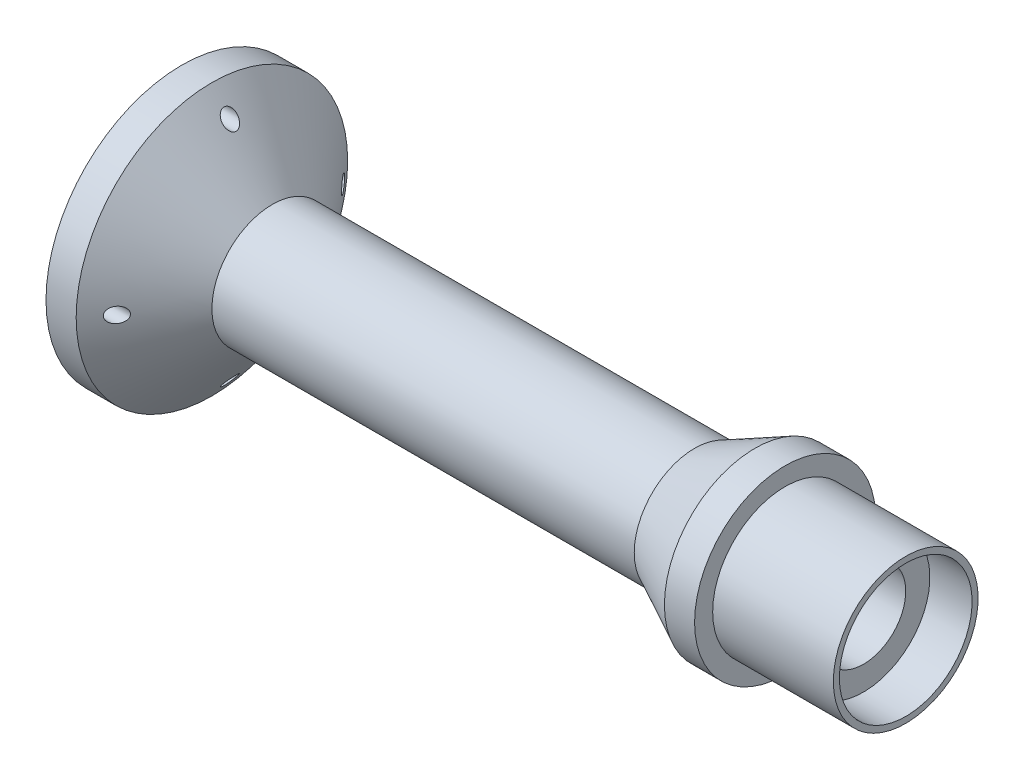
ISO-10303-21;
HEADER;
FILE_DESCRIPTION(('STEP AP214'),'2;1');
FILE_NAME('part.step','',(''),(''),'','','');
FILE_SCHEMA(('AUTOMOTIVE_DESIGN { 1 0 10303 214 1 1 1 1 }'));
ENDSEC;
DATA;
#1=APPLICATION_CONTEXT('core data for automotive mechanical design processes');
#2=APPLICATION_PROTOCOL_DEFINITION('international standard','automotive_design',2000,#1);
#3=PRODUCT_CONTEXT('',#1,'mechanical');
#4=PRODUCT('Part','Part','',(#3));
#5=PRODUCT_RELATED_PRODUCT_CATEGORY('part','',(#4));
#6=PRODUCT_DEFINITION_FORMATION('','',#4);
#7=PRODUCT_DEFINITION_CONTEXT('part definition',#1,'design');
#8=PRODUCT_DEFINITION('design','',#6,#7);
#9=PRODUCT_DEFINITION_SHAPE('','',#8);
#10=(LENGTH_UNIT() NAMED_UNIT(*) SI_UNIT(.MILLI.,.METRE.));
#11=(NAMED_UNIT(*) PLANE_ANGLE_UNIT() SI_UNIT($,.RADIAN.));
#12=(NAMED_UNIT(*) SI_UNIT($,.STERADIAN.) SOLID_ANGLE_UNIT());
#13=UNCERTAINTY_MEASURE_WITH_UNIT(LENGTH_MEASURE(1.E-05),#10,'distance_accuracy_value','');
#14=(GEOMETRIC_REPRESENTATION_CONTEXT(3) GLOBAL_UNCERTAINTY_ASSIGNED_CONTEXT((#13)) GLOBAL_UNIT_ASSIGNED_CONTEXT((#10,
#11,#12)) REPRESENTATION_CONTEXT('',''));
#15=CARTESIAN_POINT('',(0.,0.,0.));
#16=DIRECTION('',(0.,0.,1.));
#17=DIRECTION('',(1.,0.,0.));
#18=AXIS2_PLACEMENT_3D('',#15,#16,#17);
#19=CARTESIAN_POINT('',(-14.2227480967605,6.99999999999999,0.));
#20=DIRECTION('',(1.,0.,0.));
#21=DIRECTION('',(0.,0.,-1.));
#22=AXIS2_PLACEMENT_3D('',#19,#20,#21);
#23=PLANE('',#22);
#24=CARTESIAN_POINT('',(-14.2227480967605,0.,18.75));
#25=DIRECTION('',(-1.,0.,0.));
#26=DIRECTION('',(0.,-1.,0.));
#27=AXIS2_PLACEMENT_3D('',#24,#25,#26);
#28=CIRCLE('',#27,1.25);
#29=CARTESIAN_POINT('',(-14.2227480967605,-1.25000000000007,18.75));
#30=VERTEX_POINT('',#29);
#31=EDGE_CURVE('E129',#30,#30,#28,.T.);
#32=ORIENTED_EDGE('',*,*,#31,.F.);
#33=EDGE_LOOP('',(#32));
#34=FACE_BOUND('',#33,.T.);
#35=CARTESIAN_POINT('',(-14.2227480967605,-18.75,0.));
#36=DIRECTION('',(-1.,0.,0.));
#37=DIRECTION('',(0.,0.,-1.));
#38=AXIS2_PLACEMENT_3D('',#35,#36,#37);
#39=CIRCLE('',#38,1.25);
#40=CARTESIAN_POINT('',(-14.2227480967605,-18.75,-1.25));
#41=VERTEX_POINT('',#40);
#42=EDGE_CURVE('E133',#41,#41,#39,.T.);
#43=ORIENTED_EDGE('',*,*,#42,.F.);
#44=EDGE_LOOP('',(#43));
#45=FACE_BOUND('',#44,.T.);
#46=CARTESIAN_POINT('',(-14.2227480967605,1.96395825309926E-13,-18.75));
#47=DIRECTION('',(-1.,0.,0.));
#48=DIRECTION('',(0.,1.,0.));
#49=AXIS2_PLACEMENT_3D('',#46,#47,#48);
#50=CIRCLE('',#49,1.25);
#51=CARTESIAN_POINT('',(-14.2227480967605,1.2500000000002,-18.75));
#52=VERTEX_POINT('',#51);
#53=EDGE_CURVE('E137',#52,#52,#50,.T.);
#54=ORIENTED_EDGE('',*,*,#53,.F.);
#55=EDGE_LOOP('',(#54));
#56=FACE_BOUND('',#55,.T.);
#57=CARTESIAN_POINT('',(-14.2227480967605,18.75,0.));
#58=DIRECTION('',(-1.,0.,0.));
#59=DIRECTION('',(0.,0.,1.));
#60=AXIS2_PLACEMENT_3D('',#57,#58,#59);
#61=CIRCLE('',#60,1.25);
#62=CARTESIAN_POINT('',(-14.2227480967605,18.75,1.25));
#63=VERTEX_POINT('',#62);
#64=EDGE_CURVE('E60',#63,#63,#61,.T.);
#65=ORIENTED_EDGE('',*,*,#64,.F.);
#66=EDGE_LOOP('',(#65));
#67=FACE_BOUND('',#66,.T.);
#68=CARTESIAN_POINT('',(-14.2227480967606,0.,0.));
#69=DIRECTION('',(-1.,0.,0.));
#70=DIRECTION('',(0.,0.,1.));
#71=AXIS2_PLACEMENT_3D('',#68,#69,#70);
#72=CIRCLE('',#71,6.99999999999999);
#73=CARTESIAN_POINT('',(-14.2227480967606,0.,6.99999999999999));
#74=VERTEX_POINT('',#73);
#75=EDGE_CURVE('E59',#74,#74,#72,.T.);
#76=ORIENTED_EDGE('',*,*,#75,.F.);
#77=EDGE_LOOP('',(#76));
#78=FACE_BOUND('',#77,.T.);
#79=CARTESIAN_POINT('',(-14.2227480967605,0.,0.));
#80=DIRECTION('',(-1.,0.,0.));
#81=DIRECTION('',(0.,0.,1.));
#82=AXIS2_PLACEMENT_3D('',#79,#80,#81);
#83=CIRCLE('',#82,22.5);
#84=CARTESIAN_POINT('',(-14.2227480967605,0.,22.5));
#85=VERTEX_POINT('',#84);
#86=EDGE_CURVE('E10',#85,#85,#83,.T.);
#87=ORIENTED_EDGE('',*,*,#86,.T.);
#88=EDGE_LOOP('',(#87));
#89=FACE_BOUND('',#88,.T.);
#90=ADVANCED_FACE('F31',(#34,#45,#56,#67,#78,#89),#23,.F.);
#91=CARTESIAN_POINT('',(0.,0.,0.));
#92=DIRECTION('',(-1.,0.,0.));
#93=DIRECTION('',(0.,0.,1.));
#94=AXIS2_PLACEMENT_3D('',#91,#92,#93);
#95=CYLINDRICAL_SURFACE('',#94,22.5);
#96=ORIENTED_EDGE('',*,*,#86,.F.);
#97=EDGE_LOOP('',(#96));
#98=FACE_BOUND('',#97,.T.);
#99=CARTESIAN_POINT('',(-9.22274809676054,0.,0.));
#100=DIRECTION('',(-1.,0.,0.));
#101=DIRECTION('',(0.,0.,1.));
#102=AXIS2_PLACEMENT_3D('',#99,#100,#101);
#103=CIRCLE('',#102,22.5);
#104=CARTESIAN_POINT('',(-9.22274809676054,0.,22.5));
#105=VERTEX_POINT('',#104);
#106=EDGE_CURVE('E43',#105,#105,#103,.T.);
#107=ORIENTED_EDGE('',*,*,#106,.T.);
#108=EDGE_LOOP('',(#107));
#109=FACE_BOUND('',#108,.T.);
#110=ADVANCED_FACE('F115',(#98,#109),#95,.T.);
#111=CARTESIAN_POINT('',(0.777251903239451,0.,0.));
#112=DIRECTION('',(-1.,0.,0.));
#113=DIRECTION('',(0.,0.,1.));
#114=AXIS2_PLACEMENT_3D('',#111,#112,#113);
#115=CONICAL_SURFACE('',#114,9.99999999999999,0.896055384571344);
#116=CARTESIAN_POINT('',(-6.87670378722897,-0.965765888497973,19.5435970316312));
#117=CARTESIAN_POINT('',(-6.91438438359733,-0.925371062022248,19.5927517523525));
#118=CARTESIAN_POINT('',(-6.95025639504498,-0.880481631938702,19.6397252175365));
#119=CARTESIAN_POINT('',(-7.01716249747079,-0.781774825555448,19.7276000037425));
#120=CARTESIAN_POINT('',(-7.04818845675402,-0.727942749200885,19.7684911131804));
#121=CARTESIAN_POINT('',(-7.10416139474303,-0.611453025938683,19.8424374038877));
#122=CARTESIAN_POINT('',(-7.12905412500325,-0.548723849578808,19.8754225921607));
#123=CARTESIAN_POINT('',(-7.17078305701836,-0.416316704997197,19.930807404557));
#124=CARTESIAN_POINT('',(-7.18763314383691,-0.346650965501321,19.9532252715871));
#125=CARTESIAN_POINT('',(-7.21019210371205,-0.213392326131725,19.9832607455488));
#126=CARTESIAN_POINT('',(-7.21716525253353,-0.150390554747603,19.992557131752));
#127=CARTESIAN_POINT('',(-7.22379820012534,-0.0233322763961994,20.0013996418606));
#128=CARTESIAN_POINT('',(-7.22346239040761,0.0407235741187451,20.0009516205923));
#129=CARTESIAN_POINT('',(-7.21595157436366,0.160584986814371,19.9909394931205));
#130=CARTESIAN_POINT('',(-7.20952840373848,0.216526813363729,19.9823775268471));
#131=CARTESIAN_POINT('',(-7.19127175817364,0.325892651835949,19.9580693838317));
#132=CARTESIAN_POINT('',(-7.17943827273827,0.379316658874151,19.9423231931527));
#133=CARTESIAN_POINT('',(-7.15052894114499,0.48391165180784,19.9039162271677));
#134=CARTESIAN_POINT('',(-7.13331445213224,0.534976365655285,19.8810726944295));
#135=CARTESIAN_POINT('',(-7.09450348825448,0.632322518951626,19.8296767976997));
#136=CARTESIAN_POINT('',(-7.07290532914588,0.678602109568131,19.801122239545));
#137=CARTESIAN_POINT('',(-7.02291341430539,0.771739478498307,19.7351883464936));
#138=CARTESIAN_POINT('',(-6.99399650306693,0.817839447481196,19.6971387962385));
#139=CARTESIAN_POINT('',(-6.93244976711782,0.902930780359497,19.6164074064193));
#140=CARTESIAN_POINT('',(-6.8998177606586,0.941917931802534,19.5737228455587));
#141=CARTESIAN_POINT('',(-6.8250178932535,1.01966662936835,19.4762153702602));
#142=CARTESIAN_POINT('',(-6.78223181761343,1.05689954675944,19.420649185895));
#143=CARTESIAN_POINT('',(-6.69370922727141,1.12136903820618,19.3061947238403));
#144=CARTESIAN_POINT('',(-6.64797089448878,1.14859938200035,19.2473044019117));
#145=CARTESIAN_POINT('',(-6.54477632598425,1.19799551089414,19.1150571542002));
#146=CARTESIAN_POINT('',(-6.48685583980991,1.21794271647149,19.0412311117094));
#147=CARTESIAN_POINT('',(-6.36940702958332,1.24416129927918,18.8924090925181));
#148=CARTESIAN_POINT('',(-6.30987734035667,1.25042067066193,18.8174121468096));
#149=CARTESIAN_POINT('',(-6.18107626175588,1.24946648175131,18.6561175747977));
#150=CARTESIAN_POINT('',(-6.11173415853516,1.23999833256753,18.5698825472559));
#151=CARTESIAN_POINT('',(-5.97433272494049,1.20319133669582,18.4001889285737));
#152=CARTESIAN_POINT('',(-5.90627340524672,1.1758523412865,18.3167303605453));
#153=CARTESIAN_POINT('',(-5.78399931516152,1.10865780806864,18.167787353033));
#154=CARTESIAN_POINT('',(-5.7292826795341,1.07142470133918,18.1015317359721));
#155=CARTESIAN_POINT('',(-5.62404500219,0.983592915924127,17.974774958335));
#156=CARTESIAN_POINT('',(-5.57351831904188,0.93301260519025,17.9142660437908));
#157=CARTESIAN_POINT('',(-5.48986200306515,0.831427368285954,17.814550201221));
#158=CARTESIAN_POINT('',(-5.45540240043487,0.783189672461332,17.7736430509625));
#159=CARTESIAN_POINT('',(-5.39179029870844,0.678742891753287,17.6983645404968));
#160=CARTESIAN_POINT('',(-5.36263109565057,0.622544038607519,17.6639849217614));
#161=CARTESIAN_POINT('',(-5.31585059468833,0.51340199479956,17.6089619810765));
#162=CARTESIAN_POINT('',(-5.29710172302202,0.461628417736807,17.5869658369315));
#163=CARTESIAN_POINT('',(-5.26539673220317,0.353986860268963,17.5498220002909));
#164=CARTESIAN_POINT('',(-5.25243719016564,0.298121322000789,17.5346702610478));
#165=CARTESIAN_POINT('',(-5.23314940958656,0.183373669540542,17.5121353630539));
#166=CARTESIAN_POINT('',(-5.22685828783104,0.124476564627158,17.5047956857337));
#167=CARTESIAN_POINT('',(-5.22155429885013,0.00591363480842162,17.498606950173));
#168=CARTESIAN_POINT('',(-5.22253915528182,-0.0537519438431116,17.4997552364112));
#169=CARTESIAN_POINT('',(-5.23126389457711,-0.16624545079928,17.5099375178887));
#170=CARTESIAN_POINT('',(-5.23836808621042,-0.219193872841721,17.5182294296655));
#171=CARTESIAN_POINT('',(-5.25801253144165,-0.32262241416195,17.5411896740102));
#172=CARTESIAN_POINT('',(-5.2705533525931,-0.373102275123429,17.5558586723106));
#173=CARTESIAN_POINT('',(-5.30101229547472,-0.472672796439294,17.5915534679253));
#174=CARTESIAN_POINT('',(-5.3191386852663,-0.521610074289808,17.6128257597406));
#175=CARTESIAN_POINT('',(-5.35965639132989,-0.614998111505125,17.660490194846));
#176=CARTESIAN_POINT('',(-5.38205020167623,-0.659446223838874,17.6868853323271));
#177=CARTESIAN_POINT('',(-5.44125760429919,-0.762656001992348,17.756866280301));
#178=CARTESIAN_POINT('',(-5.47999548720466,-0.818725694776381,17.8028086698598));
#179=CARTESIAN_POINT('',(-5.56260226733139,-0.920397655867401,17.9012375312287));
#180=CARTESIAN_POINT('',(-5.60648200281037,-0.965977190997547,17.9537378420926));
#181=CARTESIAN_POINT('',(-5.7098671054036,-1.05755735418722,18.0780539649628));
#182=CARTESIAN_POINT('',(-5.77042291508978,-1.10044120067992,18.1512916255385));
#183=CARTESIAN_POINT('',(-5.89462846215224,-1.17012388073995,18.3025084814554));
#184=CARTESIAN_POINT('',(-5.95827903172755,-1.1969183616339,18.3804889535966));
#185=CARTESIAN_POINT('',(-6.08759505935107,-1.23498236384621,18.5399771135167));
#186=CARTESIAN_POINT('',(-6.15327489810404,-1.24607997257237,18.6215139270986));
#187=CARTESIAN_POINT('',(-6.28448189862038,-1.25218939408474,18.7854797427909));
#188=CARTESIAN_POINT('',(-6.3500087601464,-1.24718073971286,18.8679097473328));
#189=CARTESIAN_POINT('',(-6.48534946191309,-1.21945319998994,19.0392502094973));
#190=CARTESIAN_POINT('',(-6.55498892743953,-1.19511724887691,19.1280433239983));
#191=CARTESIAN_POINT('',(-6.68957930291789,-1.12594156939992,19.3007658028269));
#192=CARTESIAN_POINT('',(-6.75454973147697,-1.08119373574188,19.3847150861251));
#193=CARTESIAN_POINT('',(-6.83646220905368,-1.00711730998758,19.4911509952201));
#194=CARTESIAN_POINT('',(-6.85683444169113,-0.987066474012631,19.5176772685446));
#195=CARTESIAN_POINT('',(-6.87670378722897,-0.965765888497973,19.5435970316312));
#196=B_SPLINE_CURVE_WITH_KNOTS('',3,(#116,#117,#118,#119,#120,#121,#122,#123,#124,#125,#126,
#127,#128,#129,#130,#131,#132,#133,#134,#135,#136,#137,#138,#139,#140,#141,#142,#143,#144,#145,
#146,#147,#148,#149,#150,#151,#152,#153,#154,#155,#156,#157,#158,#159,#160,#161,#162,#163,#164,
#165,#166,#167,#168,#169,#170,#171,#172,#173,#174,#175,#176,#177,#178,#179,#180,#181,#182,#183,
#184,#185,#186,#187,#188,#189,#190,#191,#192,#193,#194,#195),.UNSPECIFIED.,.T.,.F.,(4,2,2,2,2,2,
2,2,2,2,2,2,2,2,2,2,2,2,2,2,2,2,2,2,2,2,2,2,2,2,2,2,2,2,2,2,2,2,2,4),(0.,0.221740182377141,
0.443848538361616,0.667856091715364,0.891475500130169,1.08256008731353,1.27352986647541,
1.44361836741022,1.61370719830919,1.788600667749,1.96356146039212,2.16203038716296,
2.3606164751028,2.59795450065903,2.83544010629957,3.12213496929721,3.40908119686408,
3.7408000294681,4.07252162267552,4.35242328856895,4.63194175447357,4.84724333214516,
5.06227067161015,5.2394298590767,5.41648416381257,5.59451886893816,5.77249787696541,
5.933951624957,6.09542223187148,6.26384479492505,6.43236609534984,6.67758244227029,
6.92332529518567,7.23447458320957,7.54570800890564,7.86032435506921,8.17534066029726,
8.51990388783412,8.86293096570011,8.97985672399241),.UNSPECIFIED.);
#197=CARTESIAN_POINT('',(-6.87670378722897,-0.965765888497973,19.5435970316312));
#198=VERTEX_POINT('',#197);
#199=EDGE_CURVE('E34',#198,#198,#196,.T.);
#200=ORIENTED_EDGE('',*,*,#199,.T.);
#201=EDGE_LOOP('',(#200));
#202=FACE_BOUND('',#201,.T.);
#203=CARTESIAN_POINT('',(-7.10466391561831,-19.8431354198869,-0.606263106075891));
#204=CARTESIAN_POINT('',(-7.12524215492308,-19.8703705516847,-0.557152061023519));
#205=CARTESIAN_POINT('',(-7.14359337620249,-19.8947112379774,-0.505441470730656));
#206=CARTESIAN_POINT('',(-7.17501703582346,-19.9364431367164,-0.397730319003898));
#207=CARTESIAN_POINT('',(-7.18808686252739,-19.9538309109191,-0.341727651391252));
#208=CARTESIAN_POINT('',(-7.20828710079906,-19.9807230525613,-0.226556630713434));
#209=CARTESIAN_POINT('',(-7.2153938116383,-19.9901959613114,-0.167376630697725));
#210=CARTESIAN_POINT('',(-7.22313950260351,-20.0005212097117,-0.0478627158375789));
#211=CARTESIAN_POINT('',(-7.22378121925231,-20.0013771967593,0.0124706999495841));
#212=CARTESIAN_POINT('',(-7.21870726931353,-19.9946127147333,0.129107660411904));
#213=CARTESIAN_POINT('',(-7.21333154523356,-19.9874454983325,0.185453469614146));
#214=CARTESIAN_POINT('',(-7.19706469098579,-19.9657802254267,0.295881703378825));
#215=CARTESIAN_POINT('',(-7.1861728581561,-19.9512812349741,0.349963838635834));
#216=CARTESIAN_POINT('',(-7.1591639672876,-19.9153819386682,0.455583541155038));
#217=CARTESIAN_POINT('',(-7.14295215271335,-19.8938565217301,0.507053801806073));
#218=CARTESIAN_POINT('',(-7.10607420051279,-19.8449878661884,0.605410044469264));
#219=CARTESIAN_POINT('',(-7.08540655431303,-19.8176426572671,0.652294466058288));
#220=CARTESIAN_POINT('',(-7.03749114722785,-19.7543939811494,0.746529909730399));
#221=CARTESIAN_POINT('',(-7.00974183636218,-19.7178456074332,0.793190590479528));
#222=CARTESIAN_POINT('',(-6.95047070966133,-19.6400157837598,0.879636674101394));
#223=CARTESIAN_POINT('',(-6.91894672317731,-19.5987316110329,0.919418088565018));
#224=CARTESIAN_POINT('',(-6.84662870169594,-19.5043376502165,0.998988749967489));
#225=CARTESIAN_POINT('',(-6.80521522645016,-19.4504768400556,1.03732215303783));
#226=CARTESIAN_POINT('',(-6.71935165459838,-19.3392863848301,1.10429191837341));
#227=CARTESIAN_POINT('',(-6.67489967274627,-19.2819545887547,1.13292219347318));
#228=CARTESIAN_POINT('',(-6.57437861175687,-19.1528975731836,1.18574642201646));
#229=CARTESIAN_POINT('',(-6.51781975130242,-19.0806636063012,1.20777088452617));
#230=CARTESIAN_POINT('',(-6.4029266291989,-18.9347712676133,1.23851750835295));
#231=CARTESIAN_POINT('',(-6.3445909302942,-18.8611117612687,1.24722859267553));
#232=CARTESIAN_POINT('',(-6.21767515661395,-18.7017994713089,1.25200888745258));
#233=CARTESIAN_POINT('',(-6.14898315385578,-18.6161597765837,1.24577201536447));
#234=CARTESIAN_POINT('',(-6.0125109391328,-18.4471846228775,1.21579900481378));
#235=CARTESIAN_POINT('',(-5.94473090082374,-18.3638495996493,1.19205958023227));
#236=CARTESIAN_POINT('',(-5.82042734148076,-18.2120361488024,1.13089791435167));
#237=CARTESIAN_POINT('',(-5.76355654044277,-18.1430035148375,1.09555943868603));
#238=CARTESIAN_POINT('',(-5.65382745564907,-18.0105440439987,1.01087495542869));
#239=CARTESIAN_POINT('',(-5.60096405112315,-17.947110035398,0.961547219573775));
#240=CARTESIAN_POINT('',(-5.51316722853762,-17.842275608832,0.861680391921483));
#241=CARTESIAN_POINT('',(-5.47692004592415,-17.7991784240227,0.814079805073192));
#242=CARTESIAN_POINT('',(-5.40965658196996,-17.7194685814832,0.710466141713361));
#243=CARTESIAN_POINT('',(-5.37863349330303,-17.6828474818302,0.654464195592078));
#244=CARTESIAN_POINT('',(-5.32863038689386,-17.6239752147391,0.545589072584731));
#245=CARTESIAN_POINT('',(-5.30848560424449,-17.6003210127047,0.494014176791489));
#246=CARTESIAN_POINT('',(-5.27395747774196,-17.559841074919,0.386416713062133));
#247=CARTESIAN_POINT('',(-5.25957079075541,-17.543011376806,0.330396748626624));
#248=CARTESIAN_POINT('',(-5.23747257460215,-17.5171823459367,0.214897137297073));
#249=CARTESIAN_POINT('',(-5.22980284706188,-17.5082320472401,0.155398249227911));
#250=CARTESIAN_POINT('',(-5.22193228760343,-17.4990475284078,0.0352451112842937));
#251=CARTESIAN_POINT('',(-5.22172817653684,-17.4988094815596,-0.0254086196313645));
#252=CARTESIAN_POINT('',(-5.22842335238635,-17.5066221777686,-0.139413061349405));
#253=CARTESIAN_POINT('',(-5.23458973912503,-17.5138177153084,-0.192869982347589));
#254=CARTESIAN_POINT('',(-5.25250237033653,-17.534746899553,-0.297501869141762));
#255=CARTESIAN_POINT('',(-5.26424905929968,-17.5484810670825,-0.348676652802379));
#256=CARTESIAN_POINT('',(-5.29306156731864,-17.5822295719053,-0.449114325577571));
#257=CARTESIAN_POINT('',(-5.31027495447526,-17.6024182582093,-0.498275342539396));
#258=CARTESIAN_POINT('',(-5.34903325078319,-17.6479814966462,-0.592274400780272));
#259=CARTESIAN_POINT('',(-5.37058055137392,-17.6733589120314,-0.637110035027488));
#260=CARTESIAN_POINT('',(-5.42750355307892,-17.7405815115433,-0.740879335168153));
#261=CARTESIAN_POINT('',(-5.46478011280669,-17.784745641337,-0.797276616380229));
#262=CARTESIAN_POINT('',(-5.544537724255,-17.8796690847,-0.899964314296418));
#263=CARTESIAN_POINT('',(-5.58702962306195,-17.9304421575675,-0.946233089723657));
#264=CARTESIAN_POINT('',(-5.68761036176611,-18.0512118707484,-1.03995870290641));
#265=CARTESIAN_POINT('',(-5.74680173472941,-18.1226852651565,-1.08432796278519));
#266=CARTESIAN_POINT('',(-5.86847811565169,-18.2705705389091,-1.15734937663312));
#267=CARTESIAN_POINT('',(-5.93096457317363,-18.346984595133,-1.18599454901328));
#268=CARTESIAN_POINT('',(-6.05822297336967,-18.5036341176503,-1.2281936814975));
#269=CARTESIAN_POINT('',(-6.12301345893485,-18.5839047301939,-1.24156008240775));
#270=CARTESIAN_POINT('',(-6.25262909293524,-18.7455465415166,-1.25261576006377));
#271=CARTESIAN_POINT('',(-6.3174542414897,-18.8269183026184,-1.25029670006948));
#272=CARTESIAN_POINT('',(-6.45244125965246,-18.9974389572724,-1.22858773971078));
#273=CARTESIAN_POINT('',(-6.52244086112434,-19.0864984012114,-1.2074152056363));
#274=CARTESIAN_POINT('',(-6.65836294561295,-19.260566891874,-1.14470733146275));
#275=CARTESIAN_POINT('',(-6.72428938592859,-19.3455798509328,-1.10319211719878));
#276=CARTESIAN_POINT('',(-6.82993080728089,-19.4825942929576,-1.01501888957127));
#277=CARTESIAN_POINT('',(-6.87148624264997,-19.5367273773607,-0.973837348662053));
#278=CARTESIAN_POINT('',(-6.94986503910075,-19.6391951739265,-0.881232393651121));
#279=CARTESIAN_POINT('',(-6.98670318543653,-19.6875479697422,-0.829842335566851));
#280=CARTESIAN_POINT('',(-7.03586894984126,-19.7522728644422,-0.747685616334311));
#281=CARTESIAN_POINT('',(-7.05067188581386,-19.7717905312542,-0.72080954647432));
#282=CARTESIAN_POINT('',(-7.07881290760933,-19.8089414187493,-0.665031192070938));
#283=CARTESIAN_POINT('',(-7.09215017845221,-19.8265735908618,-0.636127794722777));
#284=CARTESIAN_POINT('',(-7.10466391561831,-19.8431354198869,-0.606263106075891));
#285=B_SPLINE_CURVE_WITH_KNOTS('',3,(#203,#204,#205,#206,#207,#208,#209,#210,#211,#212,#213,
#214,#215,#216,#217,#218,#219,#220,#221,#222,#223,#224,#225,#226,#227,#228,#229,#230,#231,#232,
#233,#234,#235,#236,#237,#238,#239,#240,#241,#242,#243,#244,#245,#246,#247,#248,#249,#250,#251,
#252,#253,#254,#255,#256,#257,#258,#259,#260,#261,#262,#263,#264,#265,#266,#267,#268,#269,#270,
#271,#272,#273,#274,#275,#276,#277,#278,#279,#280,#281,#282,#283,#284),.UNSPECIFIED.,.T.,.F.,(4,
2,2,2,2,2,2,2,2,2,2,2,2,2,2,2,2,2,2,2,2,2,2,2,2,2,2,2,2,2,2,2,2,2,2,2,2,2,2,2,4),(0.,
0.179313236141833,0.358715034081725,0.53882654138626,0.718861807327507,0.889217683549929,
1.05959526578028,1.23318910693897,1.4068418128576,1.60244801978754,1.79816725633276,
2.03134705519957,2.26467286759529,2.54664562131978,2.8288528544884,3.15731515933961,
3.48583914897337,3.77325603107372,4.06029922590614,4.28071917278871,4.50084963781395,
4.68075462247542,4.86055500278108,5.04146654127741,5.22229861642162,5.38441751751438,
5.54654933410277,5.71349476675664,5.88053257333869,6.12145630330757,6.36288988925743,
6.66986826817929,6.97698283731757,7.28782830947128,7.59883900733781,7.94280148663761,
8.28642435494933,8.52472488333515,8.76225921352508,8.87124025429926,8.98028159035575),.UNSPECIFIED.);
#286=CARTESIAN_POINT('',(-7.10466391561831,-19.8431354198869,-0.606263106075891));
#287=VERTEX_POINT('',#286);
#288=EDGE_CURVE('E192',#287,#287,#285,.T.);
#289=ORIENTED_EDGE('',*,*,#288,.T.);
#290=EDGE_LOOP('',(#289));
#291=FACE_BOUND('',#290,.T.);
#292=CARTESIAN_POINT('',(-7.10466391561831,-0.606263106075691,-19.8431354198869));
#293=CARTESIAN_POINT('',(-7.07765589612822,-0.670707160757503,-19.8073906671846));
#294=CARTESIAN_POINT('',(-7.04677164704742,-0.730762853658854,-19.7666072768288));
#295=CARTESIAN_POINT('',(-6.97901128341762,-0.841070703896715,-19.6774450231569));
#296=CARTESIAN_POINT('',(-6.94212392636064,-0.891304069871235,-19.6290519143568));
#297=CARTESIAN_POINT('',(-6.86422261662559,-0.981296733151444,-19.5272592215702));
#298=CARTESIAN_POINT('',(-6.82324544409265,-1.02113948070949,-19.4739045107011));
#299=CARTESIAN_POINT('',(-6.73812338184288,-1.09102325327259,-19.363544024507));
#300=CARTESIAN_POINT('',(-6.69397937699688,-1.12106700338338,-19.3065392695458));
#301=CARTESIAN_POINT('',(-6.59480106892106,-1.17648980851387,-19.1790463751906));
#302=CARTESIAN_POINT('',(-6.53929629488374,-1.19988415601664,-19.1080613317609));
#303=CARTESIAN_POINT('',(-6.42640716269205,-1.23366694580475,-18.9645022396984));
#304=CARTESIAN_POINT('',(-6.36902145224862,-1.24404581045568,-18.8919270608508));
#305=CARTESIAN_POINT('',(-6.24365168130871,-1.25279658939634,-18.7342910894716));
#306=CARTESIAN_POINT('',(-6.17552508979548,-1.24882608112653,-18.6492061793305));
#307=CARTESIAN_POINT('',(-6.03986727023128,-1.22366326446298,-18.4809337747305));
#308=CARTESIAN_POINT('',(-5.97233702151561,-1.2024465844457,-18.3977491368065));
#309=CARTESIAN_POINT('',(-5.83637046468106,-1.14097063674486,-18.2313793202122));
#310=CARTESIAN_POINT('',(-5.76807251456554,-1.09977066688745,-18.1484231025332));
#311=CARTESIAN_POINT('',(-5.63733692807535,-0.997355614918536,-17.9906722151724));
#312=CARTESIAN_POINT('',(-5.57488347576294,-0.936196685700554,-17.9158554243042));
#313=CARTESIAN_POINT('',(-5.48205136414942,-0.820797208363604,-17.8052688592364));
#314=CARTESIAN_POINT('',(-5.44854188782469,-0.77285948320953,-17.7655102991303));
#315=CARTESIAN_POINT('',(-5.38674387472409,-0.669329343699035,-17.6924095290839));
#316=CARTESIAN_POINT('',(-5.35844735899939,-0.613748858960362,-17.659057509906));
#317=CARTESIAN_POINT('',(-5.31275722282861,-0.505247037772933,-17.6053299753233));
#318=CARTESIAN_POINT('',(-5.29433811064653,-0.453370176902428,-17.5837252567121));
#319=CARTESIAN_POINT('',(-5.26331154922155,-0.345597635707015,-17.5473825040633));
#320=CARTESIAN_POINT('',(-5.25070120917556,-0.28970397043698,-17.5326410544007));
#321=CARTESIAN_POINT('',(-5.23211683830009,-0.175008335528856,-17.5109301270836));
#322=CARTESIAN_POINT('',(-5.22617867461797,-0.116192405612299,-17.5040026537043));
#323=CARTESIAN_POINT('',(-5.22154979323207,0.00210761853794943,-17.4986017701801));
#324=CARTESIAN_POINT('',(-5.22285686879864,0.0615915038201039,-17.5001257859102));
#325=CARTESIAN_POINT('',(-5.23214989323306,0.173764143892576,-17.5109717460022));
#326=CARTESIAN_POINT('',(-5.23951632185852,0.226578132964675,-17.5195703856954));
#327=CARTESIAN_POINT('',(-5.25964693247815,0.329686323014147,-17.5431011884625));
#328=CARTESIAN_POINT('',(-5.272411719369,0.379980240905989,-17.5580340613001));
#329=CARTESIAN_POINT('',(-5.3033392675856,0.479317323173559,-17.5942833228954));
#330=CARTESIAN_POINT('',(-5.32172630317219,0.528192353030757,-17.6158652874553));
#331=CARTESIAN_POINT('',(-5.36274691437925,0.621409172402179,-17.664131032601));
#332=CARTESIAN_POINT('',(-5.38538301071288,0.665748246758001,-17.6908178417652));
#333=CARTESIAN_POINT('',(-5.44524386971224,0.768791216757673,-17.7615889412216));
#334=CARTESIAN_POINT('',(-5.4843985993646,0.824758935996352,-17.8080394423376));
#335=CARTESIAN_POINT('',(-5.56781654528281,0.926122919220789,-17.9074682474307));
#336=CARTESIAN_POINT('',(-5.61209049951722,0.971496336539179,-17.9604602891212));
#337=CARTESIAN_POINT('',(-5.71625801794216,1.06243499913266,-18.0857692230004));
#338=CARTESIAN_POINT('',(-5.77718622215647,1.10487869317759,-18.1594909496072));
#339=CARTESIAN_POINT('',(-5.90208760102806,1.17358695667578,-18.3116289359591));
#340=CARTESIAN_POINT('',(-5.96606191165386,1.199845438543,-18.3900469499211));
#341=CARTESIAN_POINT('',(-6.09596942349295,1.23671924542944,-18.5503520780831));
#342=CARTESIAN_POINT('',(-6.16191634285541,1.24716188149746,-18.6322675862229));
#343=CARTESIAN_POINT('',(-6.29354410975,1.25183323726407,-18.7968564732237));
#344=CARTESIAN_POINT('',(-6.3592247558631,1.24605138538691,-18.8795303112199));
#345=CARTESIAN_POINT('',(-6.49447169020765,1.21663448363603,-19.050857408962));
#346=CARTESIAN_POINT('',(-6.56386597913255,1.19146155988802,-19.1393907022492));
#347=CARTESIAN_POINT('',(-6.69801818331902,1.12057845862037,-19.3116461184439));
#348=CARTESIAN_POINT('',(-6.76278360195037,1.07490243394221,-19.395375982099));
#349=CARTESIAN_POINT('',(-6.8652692605492,0.980138951061462,-19.5286133021793));
#350=CARTESIAN_POINT('',(-6.90506334050535,0.936702651771272,-19.5805670819451));
#351=CARTESIAN_POINT('',(-6.97971832469373,0.839856671629066,-19.6783635628161));
#352=CARTESIAN_POINT('',(-7.0145865739804,0.786462121687359,-19.7242153567288));
#353=CARTESIAN_POINT('',(-7.07251651698691,0.679912964226757,-19.8006025773299));
#354=CARTESIAN_POINT('',(-7.0965775757393,0.628222325869564,-19.8324170454435));
#355=CARTESIAN_POINT('',(-7.13918493607614,0.518927565522803,-19.8888544668187));
#356=CARTESIAN_POINT('',(-7.15773308950448,0.461325438032282,-19.9134798349264));
#357=CARTESIAN_POINT('',(-7.18840327138182,0.341092288294774,-19.9542460617273));
#358=CARTESIAN_POINT('',(-7.20048281179302,0.278431053934085,-19.9703308170983));
#359=CARTESIAN_POINT('',(-7.21720932466875,0.150412412382754,-19.9926132124996));
#360=CARTESIAN_POINT('',(-7.22186102245648,0.0850567464629828,-19.9988171383476));
#361=CARTESIAN_POINT('',(-7.22331655734401,-0.0383849275379265,-20.0007580334329));
#362=CARTESIAN_POINT('',(-7.22095695786809,-0.0964476514459743,-19.9976107581585));
#363=CARTESIAN_POINT('',(-7.21030165634798,-0.211019209466393,-19.9834100258707));
#364=CARTESIAN_POINT('',(-7.20200765195728,-0.267528483174117,-19.9723588299301));
#365=CARTESIAN_POINT('',(-7.18085777319609,-0.372933356074558,-19.9442151746772));
#366=CARTESIAN_POINT('',(-7.16843454492398,-0.422072513057965,-19.9276961256127));
#367=CARTESIAN_POINT('',(-7.13948986488464,-0.516901420729008,-19.8892691210123));
#368=CARTESIAN_POINT('',(-7.12296699778999,-0.562589973036437,-19.8673593044318));
#369=CARTESIAN_POINT('',(-7.10466391561831,-0.606263106075691,-19.8431354198869));
#370=B_SPLINE_CURVE_WITH_KNOTS('',3,(#292,#293,#294,#295,#296,#297,#298,#299,#300,#301,#302,
#303,#304,#305,#306,#307,#308,#309,#310,#311,#312,#313,#314,#315,#316,#317,#318,#319,#320,#321,
#322,#323,#324,#325,#326,#327,#328,#329,#330,#331,#332,#333,#334,#335,#336,#337,#338,#339,#340,
#341,#342,#343,#344,#345,#346,#347,#348,#349,#350,#351,#352,#353,#354,#355,#356,#357,#358,#359,
#360,#361,#362,#363,#364,#365,#366,#367,#368,#369),.UNSPECIFIED.,.T.,.F.,(4,2,2,2,2,2,2,2,2,2,2,
2,2,2,2,2,2,2,2,2,2,2,2,2,2,2,2,2,2,2,2,2,2,2,2,2,2,2,4),(0.,0.23522376989798,0.470893241955246,
0.704607242662015,0.938256191867535,1.21649914656362,1.49494673051164,1.82075355555715,
2.14702160031429,2.49040794491751,2.83283641079989,3.04427593852437,3.25538909853913,
3.43207444729245,3.60867177127404,3.78621394188967,3.9637020403033,4.12501514338041,
4.28634632669995,4.45521272930699,4.62417962866023,4.87062676343323,5.11760055290299,
5.42987768541424,5.74227220012125,6.05805368049748,6.37404096600406,6.71805228704282,
7.06149268886118,7.29627702865231,7.53070749318035,7.72578979046038,7.92080648325579,
8.11708887056022,8.31324634033316,8.48697361418699,8.66065120978964,8.8200050675136,
8.97941401605775),.UNSPECIFIED.);
#371=CARTESIAN_POINT('',(-7.10466391561831,-0.606263106075691,-19.8431354198869));
#372=VERTEX_POINT('',#371);
#373=EDGE_CURVE('E61',#372,#372,#370,.T.);
#374=ORIENTED_EDGE('',*,*,#373,.T.);
#375=EDGE_LOOP('',(#374));
#376=FACE_BOUND('',#375,.T.);
#377=CARTESIAN_POINT('',(-6.87670378722897,19.5435970316312,-0.965765888497906));
#378=CARTESIAN_POINT('',(-6.82239952564751,19.4727581732145,-1.02397304896297));
#379=CARTESIAN_POINT('',(-6.76423409196641,19.3972554351929,-1.07296055037686));
#380=CARTESIAN_POINT('',(-6.64301764380763,19.2408759442627,-1.15294534080357));
#381=CARTESIAN_POINT('',(-6.57995903697722,19.1599908688651,-1.18391401220977));
#382=CARTESIAN_POINT('',(-6.45672547149447,19.002941872801,-1.22659967524712));
#383=CARTESIAN_POINT('',(-6.39677932339937,18.9269822035828,-1.23976125785994));
#384=CARTESIAN_POINT('',(-6.27591588768324,18.7747586396591,-1.25208557368974));
#385=CARTESIAN_POINT('',(-6.21499880180203,18.6984948105581,-1.25125117804287));
#386=CARTESIAN_POINT('',(-6.08354522420828,18.5349295798742,-1.2345262861296));
#387=CARTESIAN_POINT('',(-6.0130450243859,18.4478360555779,-1.21622456530918));
#388=CARTESIAN_POINT('',(-5.87440017063826,18.2777547987447,-1.16080940129936));
#389=CARTESIAN_POINT('',(-5.80625500587123,18.1947661740888,-1.12370006546611));
#390=CARTESIAN_POINT('',(-5.69043064561517,18.0546375936411,-1.04112681926483));
#391=CARTESIAN_POINT('',(-5.64170089431724,17.9960012761709,-0.999665831363241));
#392=CARTESIAN_POINT('',(-5.54883854082268,17.8847802016542,-0.905099618966781));
#393=CARTESIAN_POINT('',(-5.50469890259809,17.83218616923,-0.852012615525403));
#394=CARTESIAN_POINT('',(-5.43206542073897,17.7459864411273,-0.747003863339738));
#395=CARTESIAN_POINT('',(-5.40225717582163,17.7107393320969,-0.697342964921451));
#396=CARTESIAN_POINT('',(-5.34813145035721,17.6469051600518,-0.591188332900368));
#397=CARTESIAN_POINT('',(-5.32380766829535,17.6183104523758,-0.534702556762317));
#398=CARTESIAN_POINT('',(-5.28541594200974,17.5732631410416,-0.425124510882315));
#399=CARTESIAN_POINT('',(-5.27033919831125,17.5556112447289,-0.372881951538719));
#400=CARTESIAN_POINT('',(-5.24604847424134,17.5272001809001,-0.265239826117897));
#401=CARTESIAN_POINT('',(-5.23683112170099,17.5164370487709,-0.209842095930107));
#402=CARTESIAN_POINT('',(-5.22488111953674,17.5024871516235,-0.0971805586025131));
#403=CARTESIAN_POINT('',(-5.22217309738879,17.4993291598977,-0.0399104928588952));
#404=CARTESIAN_POINT('',(-5.22352749233942,17.5009093032147,0.0744395927581381));
#405=CARTESIAN_POINT('',(-5.22758974804063,17.5056472500256,0.131519617129466));
#406=CARTESIAN_POINT('',(-5.24171183924471,17.5221375046474,0.240183909559518));
#407=CARTESIAN_POINT('',(-5.25138475967081,17.5334373527278,0.291889632387334));
#408=CARTESIAN_POINT('',(-5.27581192812243,17.5620189524917,0.392339584121311));
#409=CARTESIAN_POINT('',(-5.29056702629314,17.5793017049961,0.441083315940582));
#410=CARTESIAN_POINT('',(-5.32574362888053,17.6205896699214,0.538465757314026));
#411=CARTESIAN_POINT('',(-5.34651891081893,17.6450159622425,0.586796107984023));
#412=CARTESIAN_POINT('',(-5.39215920597689,17.69882035737,0.678493657557419));
#413=CARTESIAN_POINT('',(-5.41702695679355,17.7282017751633,0.721857501032286));
#414=CARTESIAN_POINT('',(-5.48287357390792,17.8062350672222,0.823193877134024));
#415=CARTESIAN_POINT('',(-5.52581222490911,17.8573165806493,0.878035647897267));
#416=CARTESIAN_POINT('',(-5.61657843290714,17.9658449161113,0.976206167925431));
#417=CARTESIAN_POINT('',(-5.66441632254284,18.0233052135306,1.01950986079813));
#418=CARTESIAN_POINT('',(-5.77546751860972,18.1574108842135,1.10411695768133));
#419=CARTESIAN_POINT('',(-5.83956489438601,18.2352948158727,1.14229824292441));
#420=CARTESIAN_POINT('',(-5.97027437628241,18.3952186083088,1.20162861154515));
#421=CARTESIAN_POINT('',(-6.03688712769133,18.4772595373832,1.22277329288589));
#422=CARTESIAN_POINT('',(-6.17136748719982,18.6440277246816,1.24837564752171));
#423=CARTESIAN_POINT('',(-6.23924090838463,18.7287715134713,1.25269482274232));
#424=CARTESIAN_POINT('',(-6.37406567705432,18.898244817376,1.24407646303988));
#425=CARTESIAN_POINT('',(-6.4410162921526,18.9829742737505,1.23112593843961));
#426=CARTESIAN_POINT('',(-6.5756642594257,19.1544695026481,1.18624602229027));
#427=CARTESIAN_POINT('',(-6.64321194740171,19.2411039072243,1.15334387229633));
#428=CARTESIAN_POINT('',(-6.77261133614791,19.4080869254175,1.0668724667407));
#429=CARTESIAN_POINT('',(-6.83447592759054,19.4884496990017,1.0133514889549));
#430=CARTESIAN_POINT('',(-6.92898495278981,19.6118530013971,0.907641239792509));
#431=CARTESIAN_POINT('',(-6.96427905431469,19.6581132538701,0.861539560842484));
#432=CARTESIAN_POINT('',(-7.02977339030771,19.7442076109808,0.760550254214882));
#433=CARTESIAN_POINT('',(-7.0599809239335,19.7840509202066,0.705675440319899));
#434=CARTESIAN_POINT('',(-7.10977199013085,19.8498751014718,0.596810353252104));
#435=CARTESIAN_POINT('',(-7.13027309890539,19.8770433043468,0.543960584334698));
#436=CARTESIAN_POINT('',(-7.16567864115988,19.9240299982267,0.433311977882967));
#437=CARTESIAN_POINT('',(-7.1805850940734,19.9438511411768,0.375514935373661));
#438=CARTESIAN_POINT('',(-7.20402973985093,19.9750509316629,0.256080537168597));
#439=CARTESIAN_POINT('',(-7.2125341406757,19.9863847789653,0.194424638724821));
#440=CARTESIAN_POINT('',(-7.22247859833054,19.9996395713751,0.0695506139863738));
#441=CARTESIAN_POINT('',(-7.22392159638903,20.001564435529,0.00633314914765416));
#442=CARTESIAN_POINT('',(-7.21985564327629,19.9961436775168,-0.113513647145584));
#443=CARTESIAN_POINT('',(-7.21498403803164,19.9896479564685,-0.170206342431041));
#444=CARTESIAN_POINT('',(-7.19964620269687,19.9692172878778,-0.281437001607862));
#445=CARTESIAN_POINT('',(-7.18918002698708,19.9552824126455,-0.335974986437901));
#446=CARTESIAN_POINT('',(-7.16303066593397,19.9205182157637,-0.442209988732785));
#447=CARTESIAN_POINT('',(-7.14728725456928,19.8996093179552,-0.493865787029311));
#448=CARTESIAN_POINT('',(-7.11131336206609,19.8519242869754,-0.592686756098904));
#449=CARTESIAN_POINT('',(-7.09108132950462,19.8251461252218,-0.639850366140483));
#450=CARTESIAN_POINT('',(-7.04180693327312,19.7600787143725,-0.739273870766651));
#451=CARTESIAN_POINT('',(-7.01180734675558,19.7205566188063,-0.790252434259145));
#452=CARTESIAN_POINT('',(-6.94734857172687,19.6359173238377,-0.884114470934086));
#453=CARTESIAN_POINT('',(-6.91288310294332,19.5907922488916,-0.926986330983029));
#454=CARTESIAN_POINT('',(-6.87670378722897,19.5435970316312,-0.965765888497906));
#455=B_SPLINE_CURVE_WITH_KNOTS('',3,(#377,#378,#379,#380,#381,#382,#383,#384,#385,#386,#387,
#388,#389,#390,#391,#392,#393,#394,#395,#396,#397,#398,#399,#400,#401,#402,#403,#404,#405,#406,
#407,#408,#409,#410,#411,#412,#413,#414,#415,#416,#417,#418,#419,#420,#421,#422,#423,#424,#425,
#426,#427,#428,#429,#430,#431,#432,#433,#434,#435,#436,#437,#438,#439,#440,#441,#442,#443,#444,
#445,#446,#447,#448,#449,#450,#451,#452,#453,#454),.UNSPECIFIED.,.T.,.F.,(4,2,2,2,2,2,2,2,2,2,2,
2,2,2,2,2,2,2,2,2,2,2,2,2,2,2,2,2,2,2,2,2,2,2,2,2,2,2,4),(0.,0.319344052102763,
0.639193913466684,0.931122255089849,1.22299071124096,1.56202409471409,1.90098346927119,
2.16041578118441,2.41944436708972,2.62209944409055,2.8245204751519,2.99530046748927,
3.16598208414229,3.33730845017592,3.50863073200089,3.66934553151501,3.83008722842108,
4.00344183429281,4.17691287810087,4.43461659103094,4.69287546122712,5.01477100130375,
5.3367496883532,5.66137319080714,5.98624100172639,6.32838690408364,6.66973651364599,
6.89163860927991,7.11321951339847,7.30102031357984,7.48875326029129,7.67747030345924,
7.86610873516468,8.03711077991048,8.20811116251293,8.38113356870114,8.55421587085286,
8.76667147966453,8.97942917024087),.UNSPECIFIED.);
#456=CARTESIAN_POINT('',(-6.87670378722897,19.5435970316312,-0.965765888497906));
#457=VERTEX_POINT('',#456);
#458=EDGE_CURVE('E52',#457,#457,#455,.T.);
#459=ORIENTED_EDGE('',*,*,#458,.T.);
#460=EDGE_LOOP('',(#459));
#461=FACE_BOUND('',#460,.T.);
#462=ORIENTED_EDGE('',*,*,#106,.F.);
#463=EDGE_LOOP('',(#462));
#464=FACE_BOUND('',#463,.T.);
#465=CARTESIAN_POINT('',(0.777251903239451,0.,0.));
#466=DIRECTION('',(-1.,0.,0.));
#467=DIRECTION('',(0.,0.,1.));
#468=AXIS2_PLACEMENT_3D('',#465,#466,#467);
#469=CIRCLE('',#468,9.99999999999999);
#470=CARTESIAN_POINT('',(0.777251903239451,0.,9.99999999999999));
#471=VERTEX_POINT('',#470);
#472=EDGE_CURVE('E48',#471,#471,#469,.T.);
#473=ORIENTED_EDGE('',*,*,#472,.T.);
#474=EDGE_LOOP('',(#473));
#475=FACE_BOUND('',#474,.T.);
#476=ADVANCED_FACE('F66',(#202,#291,#376,#461,#464,#475),#115,.T.);
#477=CARTESIAN_POINT('',(0.,0.,0.));
#478=DIRECTION('',(-1.,0.,0.));
#479=DIRECTION('',(0.,0.,1.));
#480=AXIS2_PLACEMENT_3D('',#477,#478,#479);
#481=CYLINDRICAL_SURFACE('',#480,9.99999999999999);
#482=ORIENTED_EDGE('',*,*,#472,.F.);
#483=EDGE_LOOP('',(#482));
#484=FACE_BOUND('',#483,.T.);
#485=CARTESIAN_POINT('',(70.7772519032394,0.,0.));
#486=DIRECTION('',(-1.,0.,0.));
#487=DIRECTION('',(0.,0.,1.));
#488=AXIS2_PLACEMENT_3D('',#485,#486,#487);
#489=CIRCLE('',#488,9.99999999999999);
#490=CARTESIAN_POINT('',(70.7772519032394,0.,9.99999999999999));
#491=VERTEX_POINT('',#490);
#492=EDGE_CURVE('E169',#491,#491,#489,.T.);
#493=ORIENTED_EDGE('',*,*,#492,.T.);
#494=EDGE_LOOP('',(#493));
#495=FACE_BOUND('',#494,.T.);
#496=ADVANCED_FACE('F107',(#484,#495),#481,.T.);
#497=CARTESIAN_POINT('',(80.7772519032394,0.,0.));
#498=DIRECTION('',(1.,0.,0.));
#499=DIRECTION('',(0.,0.,-1.));
#500=AXIS2_PLACEMENT_3D('',#497,#498,#499);
#501=CONICAL_SURFACE('',#500,15.,0.463647609000806);
#502=ORIENTED_EDGE('',*,*,#492,.F.);
#503=EDGE_LOOP('',(#502));
#504=FACE_BOUND('',#503,.T.);
#505=CARTESIAN_POINT('',(80.7772519032394,0.,0.));
#506=DIRECTION('',(-1.,0.,0.));
#507=DIRECTION('',(0.,0.,1.));
#508=AXIS2_PLACEMENT_3D('',#505,#506,#507);
#509=CIRCLE('',#508,15.);
#510=CARTESIAN_POINT('',(80.7772519032394,0.,15.));
#511=VERTEX_POINT('',#510);
#512=EDGE_CURVE('E166',#511,#511,#509,.T.);
#513=ORIENTED_EDGE('',*,*,#512,.T.);
#514=EDGE_LOOP('',(#513));
#515=FACE_BOUND('',#514,.T.);
#516=ADVANCED_FACE('F104',(#504,#515),#501,.T.);
#517=CARTESIAN_POINT('',(0.,0.,0.));
#518=DIRECTION('',(-1.,0.,0.));
#519=DIRECTION('',(0.,0.,1.));
#520=AXIS2_PLACEMENT_3D('',#517,#518,#519);
#521=CYLINDRICAL_SURFACE('',#520,15.);
#522=ORIENTED_EDGE('',*,*,#512,.F.);
#523=EDGE_LOOP('',(#522));
#524=FACE_BOUND('',#523,.T.);
#525=CARTESIAN_POINT('',(85.7772519032394,0.,0.));
#526=DIRECTION('',(-1.,0.,0.));
#527=DIRECTION('',(0.,0.,1.));
#528=AXIS2_PLACEMENT_3D('',#525,#526,#527);
#529=CIRCLE('',#528,15.);
#530=CARTESIAN_POINT('',(85.7772519032394,0.,15.));
#531=VERTEX_POINT('',#530);
#532=EDGE_CURVE('E163',#531,#531,#529,.T.);
#533=ORIENTED_EDGE('',*,*,#532,.T.);
#534=EDGE_LOOP('',(#533));
#535=FACE_BOUND('',#534,.T.);
#536=ADVANCED_FACE('F100',(#524,#535),#521,.T.);
#537=CARTESIAN_POINT('',(85.7772519032394,15.,0.));
#538=DIRECTION('',(-1.,0.,0.));
#539=DIRECTION('',(0.,0.,1.));
#540=AXIS2_PLACEMENT_3D('',#537,#538,#539);
#541=PLANE('',#540);
#542=ORIENTED_EDGE('',*,*,#532,.F.);
#543=EDGE_LOOP('',(#542));
#544=FACE_BOUND('',#543,.T.);
#545=CARTESIAN_POINT('',(85.7772519032394,0.,0.));
#546=DIRECTION('',(-1.,0.,0.));
#547=DIRECTION('',(0.,0.,1.));
#548=AXIS2_PLACEMENT_3D('',#545,#546,#547);
#549=CIRCLE('',#548,12.);
#550=CARTESIAN_POINT('',(85.7772519032394,0.,12.));
#551=VERTEX_POINT('',#550);
#552=EDGE_CURVE('E160',#551,#551,#549,.T.);
#553=ORIENTED_EDGE('',*,*,#552,.T.);
#554=EDGE_LOOP('',(#553));
#555=FACE_BOUND('',#554,.T.);
#556=ADVANCED_FACE('F96',(#544,#555),#541,.F.);
#557=CARTESIAN_POINT('',(0.,0.,0.));
#558=DIRECTION('',(-1.,0.,0.));
#559=DIRECTION('',(0.,0.,1.));
#560=AXIS2_PLACEMENT_3D('',#557,#558,#559);
#561=CYLINDRICAL_SURFACE('',#560,12.);
#562=ORIENTED_EDGE('',*,*,#552,.F.);
#563=EDGE_LOOP('',(#562));
#564=FACE_BOUND('',#563,.T.);
#565=CARTESIAN_POINT('',(105.777251903239,0.,0.));
#566=DIRECTION('',(-1.,0.,0.));
#567=DIRECTION('',(0.,0.,1.));
#568=AXIS2_PLACEMENT_3D('',#565,#566,#567);
#569=CIRCLE('',#568,12.);
#570=CARTESIAN_POINT('',(105.777251903239,0.,12.));
#571=VERTEX_POINT('',#570);
#572=EDGE_CURVE('E157',#571,#571,#569,.T.);
#573=ORIENTED_EDGE('',*,*,#572,.T.);
#574=EDGE_LOOP('',(#573));
#575=FACE_BOUND('',#574,.T.);
#576=ADVANCED_FACE('F92',(#564,#575),#561,.T.);
#577=CARTESIAN_POINT('',(105.777251903239,12.,0.));
#578=DIRECTION('',(-1.,0.,0.));
#579=DIRECTION('',(0.,0.,1.));
#580=AXIS2_PLACEMENT_3D('',#577,#578,#579);
#581=PLANE('',#580);
#582=ORIENTED_EDGE('',*,*,#572,.F.);
#583=EDGE_LOOP('',(#582));
#584=FACE_BOUND('',#583,.T.);
#585=CARTESIAN_POINT('',(105.777251903239,0.,0.));
#586=DIRECTION('',(-1.,0.,0.));
#587=DIRECTION('',(0.,0.,1.));
#588=AXIS2_PLACEMENT_3D('',#585,#586,#587);
#589=CIRCLE('',#588,11.);
#590=CARTESIAN_POINT('',(105.777251903239,0.,11.));
#591=VERTEX_POINT('',#590);
#592=EDGE_CURVE('E154',#591,#591,#589,.T.);
#593=ORIENTED_EDGE('',*,*,#592,.T.);
#594=EDGE_LOOP('',(#593));
#595=FACE_BOUND('',#594,.T.);
#596=ADVANCED_FACE('F88',(#584,#595),#581,.F.);
#597=CARTESIAN_POINT('',(0.,0.,0.));
#598=DIRECTION('',(-1.,0.,0.));
#599=DIRECTION('',(0.,0.,1.));
#600=AXIS2_PLACEMENT_3D('',#597,#598,#599);
#601=CYLINDRICAL_SURFACE('',#600,11.);
#602=ORIENTED_EDGE('',*,*,#592,.F.);
#603=EDGE_LOOP('',(#602));
#604=FACE_BOUND('',#603,.T.);
#605=CARTESIAN_POINT('',(98.7772519032394,0.,0.));
#606=DIRECTION('',(-1.,0.,0.));
#607=DIRECTION('',(0.,0.,1.));
#608=AXIS2_PLACEMENT_3D('',#605,#606,#607);
#609=CIRCLE('',#608,11.);
#610=CARTESIAN_POINT('',(98.7772519032394,0.,11.));
#611=VERTEX_POINT('',#610);
#612=EDGE_CURVE('E147',#611,#611,#609,.T.);
#613=ORIENTED_EDGE('',*,*,#612,.T.);
#614=EDGE_LOOP('',(#613));
#615=FACE_BOUND('',#614,.T.);
#616=ADVANCED_FACE('F84',(#604,#615),#601,.F.);
#617=CARTESIAN_POINT('',(98.7772519032394,6.99999999999999,0.));
#618=DIRECTION('',(-1.,0.,0.));
#619=DIRECTION('',(0.,0.,1.));
#620=AXIS2_PLACEMENT_3D('',#617,#618,#619);
#621=PLANE('',#620);
#622=ORIENTED_EDGE('',*,*,#612,.F.);
#623=EDGE_LOOP('',(#622));
#624=FACE_BOUND('',#623,.T.);
#625=CARTESIAN_POINT('',(98.7772519032394,0.,0.));
#626=DIRECTION('',(-1.,0.,0.));
#627=DIRECTION('',(0.,0.,1.));
#628=AXIS2_PLACEMENT_3D('',#625,#626,#627);
#629=CIRCLE('',#628,6.99999999999999);
#630=CARTESIAN_POINT('',(98.7772519032394,0.,6.99999999999999));
#631=VERTEX_POINT('',#630);
#632=EDGE_CURVE('E144',#631,#631,#629,.T.);
#633=ORIENTED_EDGE('',*,*,#632,.T.);
#634=EDGE_LOOP('',(#633));
#635=FACE_BOUND('',#634,.T.);
#636=ADVANCED_FACE('F80',(#624,#635),#621,.F.);
#637=CARTESIAN_POINT('',(0.,0.,0.));
#638=DIRECTION('',(-1.,0.,0.));
#639=DIRECTION('',(0.,0.,1.));
#640=AXIS2_PLACEMENT_3D('',#637,#638,#639);
#641=CYLINDRICAL_SURFACE('',#640,6.99999999999999);
#642=ORIENTED_EDGE('',*,*,#632,.F.);
#643=EDGE_LOOP('',(#642));
#644=FACE_BOUND('',#643,.T.);
#645=ORIENTED_EDGE('',*,*,#75,.T.);
#646=EDGE_LOOP('',(#645));
#647=FACE_BOUND('',#646,.T.);
#648=ADVANCED_FACE('F74',(#644,#647),#641,.F.);
#649=CARTESIAN_POINT('',(-4.22274809676055,18.75,0.));
#650=DIRECTION('',(-1.,0.,0.));
#651=DIRECTION('',(0.,0.,1.));
#652=AXIS2_PLACEMENT_3D('',#649,#650,#651);
#653=CYLINDRICAL_SURFACE('',#652,1.25);
#654=ORIENTED_EDGE('',*,*,#64,.T.);
#655=EDGE_LOOP('',(#654));
#656=FACE_BOUND('',#655,.T.);
#657=ORIENTED_EDGE('',*,*,#458,.F.);
#658=EDGE_LOOP('',(#657));
#659=FACE_BOUND('',#658,.T.);
#660=ADVANCED_FACE('F69',(#656,#659),#653,.F.);
#661=CARTESIAN_POINT('',(-4.22274809676055,1.96395825309926E-13,-18.75));
#662=DIRECTION('',(-1.,0.,0.));
#663=DIRECTION('',(0.,0.,1.));
#664=AXIS2_PLACEMENT_3D('',#661,#662,#663);
#665=CYLINDRICAL_SURFACE('',#664,1.25);
#666=ORIENTED_EDGE('',*,*,#53,.T.);
#667=EDGE_LOOP('',(#666));
#668=FACE_BOUND('',#667,.T.);
#669=ORIENTED_EDGE('',*,*,#373,.F.);
#670=EDGE_LOOP('',(#669));
#671=FACE_BOUND('',#670,.T.);
#672=ADVANCED_FACE('F73',(#668,#671),#665,.F.);
#673=CARTESIAN_POINT('',(-4.22274809676055,-18.75,0.));
#674=DIRECTION('',(-1.,0.,0.));
#675=DIRECTION('',(0.,0.,1.));
#676=AXIS2_PLACEMENT_3D('',#673,#674,#675);
#677=CYLINDRICAL_SURFACE('',#676,1.25);
#678=ORIENTED_EDGE('',*,*,#42,.T.);
#679=EDGE_LOOP('',(#678));
#680=FACE_BOUND('',#679,.T.);
#681=ORIENTED_EDGE('',*,*,#288,.F.);
#682=EDGE_LOOP('',(#681));
#683=FACE_BOUND('',#682,.T.);
#684=ADVANCED_FACE('F202',(#680,#683),#677,.F.);
#685=CARTESIAN_POINT('',(-4.22274809676055,0.,18.75));
#686=DIRECTION('',(-1.,0.,0.));
#687=DIRECTION('',(0.,0.,1.));
#688=AXIS2_PLACEMENT_3D('',#685,#686,#687);
#689=CYLINDRICAL_SURFACE('',#688,1.25);
#690=ORIENTED_EDGE('',*,*,#31,.T.);
#691=EDGE_LOOP('',(#690));
#692=FACE_BOUND('',#691,.T.);
#693=ORIENTED_EDGE('',*,*,#199,.F.);
#694=EDGE_LOOP('',(#693));
#695=FACE_BOUND('',#694,.T.);
#696=ADVANCED_FACE('F205',(#692,#695),#689,.F.);
#697=CLOSED_SHELL('',(#90,#110,#476,#496,#516,#536,#556,#576,#596,#616,#636,#648,#660,#672,#684,#696));
#698=MANIFOLD_SOLID_BREP('B2',#697);
#699=ADVANCED_BREP_SHAPE_REPRESENTATION('',(#18,#698),#14);
#700=SHAPE_DEFINITION_REPRESENTATION(#9,#699);
ENDSEC;
END-ISO-10303-21;
